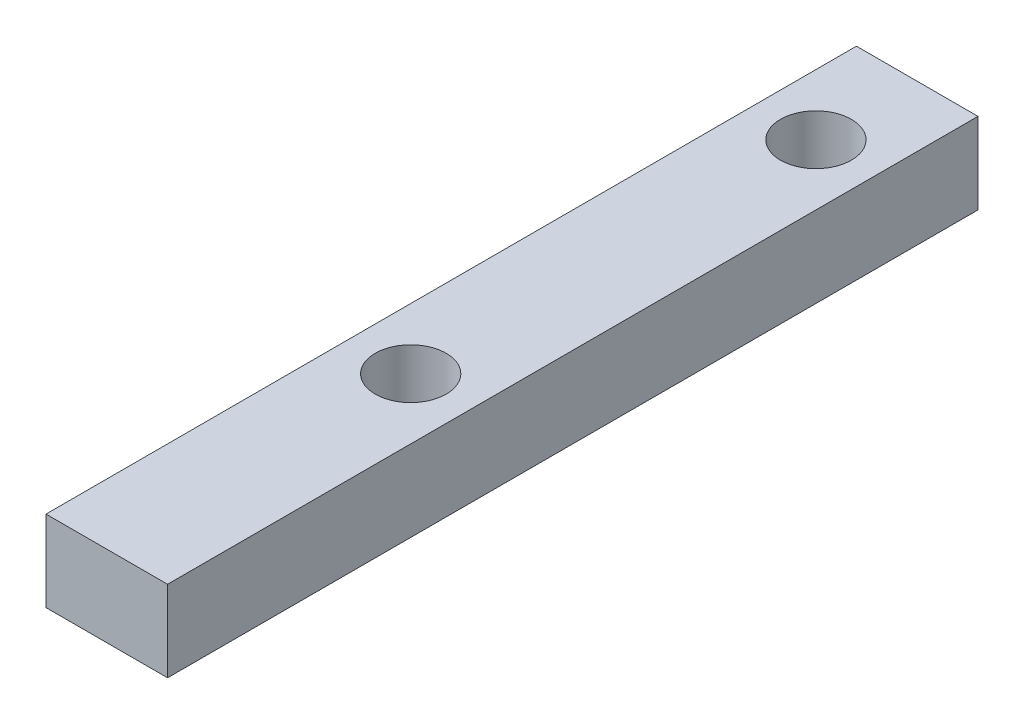
ISO-10303-21;
HEADER;
FILE_DESCRIPTION(('STEP AP214'),'2;1');
FILE_NAME('part.step','',(''),(''),'','','');
FILE_SCHEMA(('AUTOMOTIVE_DESIGN { 1 0 10303 214 1 1 1 1 }'));
ENDSEC;
DATA;
#1=APPLICATION_CONTEXT('core data for automotive mechanical design processes');
#2=APPLICATION_PROTOCOL_DEFINITION('international standard','automotive_design',2000,#1);
#3=PRODUCT_CONTEXT('',#1,'mechanical');
#4=PRODUCT('Part','Part','',(#3));
#5=PRODUCT_RELATED_PRODUCT_CATEGORY('part','',(#4));
#6=PRODUCT_DEFINITION_FORMATION('','',#4);
#7=PRODUCT_DEFINITION_CONTEXT('part definition',#1,'design');
#8=PRODUCT_DEFINITION('design','',#6,#7);
#9=PRODUCT_DEFINITION_SHAPE('','',#8);
#10=(LENGTH_UNIT() NAMED_UNIT(*) SI_UNIT(.MILLI.,.METRE.));
#11=(NAMED_UNIT(*) PLANE_ANGLE_UNIT() SI_UNIT($,.RADIAN.));
#12=(NAMED_UNIT(*) SI_UNIT($,.STERADIAN.) SOLID_ANGLE_UNIT());
#13=UNCERTAINTY_MEASURE_WITH_UNIT(LENGTH_MEASURE(1.E-05),#10,'distance_accuracy_value','');
#14=(GEOMETRIC_REPRESENTATION_CONTEXT(3) GLOBAL_UNCERTAINTY_ASSIGNED_CONTEXT((#13)) GLOBAL_UNIT_ASSIGNED_CONTEXT((#10,
#11,#12)) REPRESENTATION_CONTEXT('',''));
#15=CARTESIAN_POINT('',(0.,0.,0.));
#16=DIRECTION('',(0.,0.,1.));
#17=DIRECTION('',(1.,0.,0.));
#18=AXIS2_PLACEMENT_3D('',#15,#16,#17);
#19=CARTESIAN_POINT('',(0.,4.,0.));
#20=DIRECTION('',(0.,1.,0.));
#21=DIRECTION('',(0.,0.,1.));
#22=AXIS2_PLACEMENT_3D('',#19,#20,#21);
#23=PLANE('',#22);
#24=CARTESIAN_POINT('',(0.,4.,-15.));
#25=DIRECTION('',(0.,1.,0.));
#26=DIRECTION('',(0.,0.,1.));
#27=AXIS2_PLACEMENT_3D('',#24,#25,#26);
#28=CIRCLE('',#27,1.75);
#29=CARTESIAN_POINT('',(0.,4.,-13.25));
#30=VERTEX_POINT('',#29);
#31=EDGE_CURVE('E112',#30,#30,#28,.T.);
#32=ORIENTED_EDGE('',*,*,#31,.F.);
#33=EDGE_LOOP('',(#32));
#34=FACE_BOUND('',#33,.T.);
#35=DIRECTION('',(0.,0.,-1.));
#36=VECTOR('',#35,1.);
#37=CARTESIAN_POINT('',(3.,4.,-20.));
#38=LINE('',#37,#36);
#39=CARTESIAN_POINT('',(3.,4.,20.));
#40=VERTEX_POINT('',#39);
#41=CARTESIAN_POINT('',(3.,4.,-20.));
#42=VERTEX_POINT('',#41);
#43=EDGE_CURVE('E92',#40,#42,#38,.T.);
#44=ORIENTED_EDGE('',*,*,#43,.T.);
#45=DIRECTION('',(-1.,0.,0.));
#46=VECTOR('',#45,1.);
#47=CARTESIAN_POINT('',(-3.,4.,-20.));
#48=LINE('',#47,#46);
#49=CARTESIAN_POINT('',(-3.,4.,-20.));
#50=VERTEX_POINT('',#49);
#51=EDGE_CURVE('E87',#42,#50,#48,.T.);
#52=ORIENTED_EDGE('',*,*,#51,.T.);
#53=DIRECTION('',(0.,0.,1.));
#54=VECTOR('',#53,1.);
#55=CARTESIAN_POINT('',(-3.,4.,-20.));
#56=LINE('',#55,#54);
#57=CARTESIAN_POINT('',(-3.,4.,20.));
#58=VERTEX_POINT('',#57);
#59=EDGE_CURVE('E90',#50,#58,#56,.T.);
#60=ORIENTED_EDGE('',*,*,#59,.T.);
#61=DIRECTION('',(1.,0.,0.));
#62=VECTOR('',#61,1.);
#63=CARTESIAN_POINT('',(-3.,4.,20.));
#64=LINE('',#63,#62);
#65=EDGE_CURVE('E57',#58,#40,#64,.T.);
#66=ORIENTED_EDGE('',*,*,#65,.T.);
#67=EDGE_LOOP('',(#44,#52,#60,#66));
#68=FACE_BOUND('',#67,.T.);
#69=CARTESIAN_POINT('',(0.,4.,5.));
#70=DIRECTION('',(0.,1.,0.));
#71=DIRECTION('',(0.,0.,1.));
#72=AXIS2_PLACEMENT_3D('',#69,#70,#71);
#73=CIRCLE('',#72,1.75);
#74=CARTESIAN_POINT('',(0.,4.,6.75));
#75=VERTEX_POINT('',#74);
#76=EDGE_CURVE('E134',#75,#75,#73,.T.);
#77=ORIENTED_EDGE('',*,*,#76,.F.);
#78=EDGE_LOOP('',(#77));
#79=FACE_BOUND('',#78,.T.);
#80=ADVANCED_FACE('F39',(#34,#68,#79),#23,.T.);
#81=CARTESIAN_POINT('',(0.,0.,0.));
#82=DIRECTION('',(0.,1.,0.));
#83=DIRECTION('',(0.,0.,1.));
#84=AXIS2_PLACEMENT_3D('',#81,#82,#83);
#85=PLANE('',#84);
#86=DIRECTION('',(0.,0.,-1.));
#87=VECTOR('',#86,1.);
#88=CARTESIAN_POINT('',(3.,0.,-20.));
#89=LINE('',#88,#87);
#90=CARTESIAN_POINT('',(3.,0.,20.));
#91=VERTEX_POINT('',#90);
#92=CARTESIAN_POINT('',(3.,0.,-20.));
#93=VERTEX_POINT('',#92);
#94=EDGE_CURVE('E108',#91,#93,#89,.T.);
#95=ORIENTED_EDGE('',*,*,#94,.F.);
#96=DIRECTION('',(1.,0.,0.));
#97=VECTOR('',#96,1.);
#98=CARTESIAN_POINT('',(-3.,0.,20.));
#99=LINE('',#98,#97);
#100=CARTESIAN_POINT('',(-3.,0.,20.));
#101=VERTEX_POINT('',#100);
#102=EDGE_CURVE('E80',#101,#91,#99,.T.);
#103=ORIENTED_EDGE('',*,*,#102,.F.);
#104=DIRECTION('',(0.,0.,1.));
#105=VECTOR('',#104,1.);
#106=CARTESIAN_POINT('',(-3.,0.,-20.));
#107=LINE('',#106,#105);
#108=CARTESIAN_POINT('',(-3.,0.,-20.));
#109=VERTEX_POINT('',#108);
#110=EDGE_CURVE('E74',#109,#101,#107,.T.);
#111=ORIENTED_EDGE('',*,*,#110,.F.);
#112=DIRECTION('',(-1.,0.,0.));
#113=VECTOR('',#112,1.);
#114=CARTESIAN_POINT('',(-3.,0.,-20.));
#115=LINE('',#114,#113);
#116=EDGE_CURVE('E97',#93,#109,#115,.T.);
#117=ORIENTED_EDGE('',*,*,#116,.F.);
#118=EDGE_LOOP('',(#95,#103,#111,#117));
#119=FACE_BOUND('',#118,.T.);
#120=CARTESIAN_POINT('',(0.,0.,-15.));
#121=DIRECTION('',(0.,1.,0.));
#122=DIRECTION('',(0.,0.,1.));
#123=AXIS2_PLACEMENT_3D('',#120,#121,#122);
#124=CIRCLE('',#123,1.75);
#125=CARTESIAN_POINT('',(0.,0.,-13.25));
#126=VERTEX_POINT('',#125);
#127=EDGE_CURVE('E130',#126,#126,#124,.T.);
#128=ORIENTED_EDGE('',*,*,#127,.T.);
#129=EDGE_LOOP('',(#128));
#130=FACE_BOUND('',#129,.T.);
#131=CARTESIAN_POINT('',(0.,0.,5.));
#132=DIRECTION('',(0.,1.,0.));
#133=DIRECTION('',(0.,0.,1.));
#134=AXIS2_PLACEMENT_3D('',#131,#132,#133);
#135=CIRCLE('',#134,1.75);
#136=CARTESIAN_POINT('',(0.,0.,6.75));
#137=VERTEX_POINT('',#136);
#138=EDGE_CURVE('E138',#137,#137,#135,.T.);
#139=ORIENTED_EDGE('',*,*,#138,.T.);
#140=EDGE_LOOP('',(#139));
#141=FACE_BOUND('',#140,.T.);
#142=ADVANCED_FACE('F125',(#119,#130,#141),#85,.F.);
#143=CARTESIAN_POINT('',(3.,4.,-20.));
#144=DIRECTION('',(-1.,0.,0.));
#145=DIRECTION('',(0.,0.,1.));
#146=AXIS2_PLACEMENT_3D('',#143,#144,#145);
#147=PLANE('',#146);
#148=ORIENTED_EDGE('',*,*,#94,.T.);
#149=DIRECTION('',(0.,-1.,0.));
#150=VECTOR('',#149,1.);
#151=CARTESIAN_POINT('',(3.,4.,-20.));
#152=LINE('',#151,#150);
#153=EDGE_CURVE('E11',#42,#93,#152,.T.);
#154=ORIENTED_EDGE('',*,*,#153,.F.);
#155=ORIENTED_EDGE('',*,*,#43,.F.);
#156=DIRECTION('',(0.,-1.,0.));
#157=VECTOR('',#156,1.);
#158=CARTESIAN_POINT('',(3.,4.,20.));
#159=LINE('',#158,#157);
#160=EDGE_CURVE('E104',#40,#91,#159,.T.);
#161=ORIENTED_EDGE('',*,*,#160,.T.);
#162=EDGE_LOOP('',(#148,#154,#155,#161));
#163=FACE_BOUND('',#162,.T.);
#164=ADVANCED_FACE('F41',(#163),#147,.F.);
#165=CARTESIAN_POINT('',(-3.,4.,-20.));
#166=DIRECTION('',(0.,0.,1.));
#167=DIRECTION('',(1.,0.,0.));
#168=AXIS2_PLACEMENT_3D('',#165,#166,#167);
#169=PLANE('',#168);
#170=ORIENTED_EDGE('',*,*,#116,.T.);
#171=DIRECTION('',(0.,-1.,0.));
#172=VECTOR('',#171,1.);
#173=CARTESIAN_POINT('',(-3.,4.,-20.));
#174=LINE('',#173,#172);
#175=EDGE_CURVE('E49',#50,#109,#174,.T.);
#176=ORIENTED_EDGE('',*,*,#175,.F.);
#177=ORIENTED_EDGE('',*,*,#51,.F.);
#178=ORIENTED_EDGE('',*,*,#153,.T.);
#179=EDGE_LOOP('',(#170,#176,#177,#178));
#180=FACE_BOUND('',#179,.T.);
#181=ADVANCED_FACE('F96',(#180),#169,.F.);
#182=CARTESIAN_POINT('',(-3.,4.,-20.));
#183=DIRECTION('',(1.,0.,0.));
#184=DIRECTION('',(0.,0.,-1.));
#185=AXIS2_PLACEMENT_3D('',#182,#183,#184);
#186=PLANE('',#185);
#187=ORIENTED_EDGE('',*,*,#110,.T.);
#188=DIRECTION('',(0.,-1.,0.));
#189=VECTOR('',#188,1.);
#190=CARTESIAN_POINT('',(-3.,4.,20.));
#191=LINE('',#190,#189);
#192=EDGE_CURVE('E99',#58,#101,#191,.T.);
#193=ORIENTED_EDGE('',*,*,#192,.F.);
#194=ORIENTED_EDGE('',*,*,#59,.F.);
#195=ORIENTED_EDGE('',*,*,#175,.T.);
#196=EDGE_LOOP('',(#187,#193,#194,#195));
#197=FACE_BOUND('',#196,.T.);
#198=ADVANCED_FACE('F100',(#197),#186,.F.);
#199=CARTESIAN_POINT('',(-3.,4.,20.));
#200=DIRECTION('',(0.,0.,-1.));
#201=DIRECTION('',(-1.,0.,0.));
#202=AXIS2_PLACEMENT_3D('',#199,#200,#201);
#203=PLANE('',#202);
#204=ORIENTED_EDGE('',*,*,#102,.T.);
#205=ORIENTED_EDGE('',*,*,#160,.F.);
#206=ORIENTED_EDGE('',*,*,#65,.F.);
#207=ORIENTED_EDGE('',*,*,#192,.T.);
#208=EDGE_LOOP('',(#204,#205,#206,#207));
#209=FACE_BOUND('',#208,.T.);
#210=ADVANCED_FACE('F122',(#209),#203,.F.);
#211=CARTESIAN_POINT('',(0.,4.,-15.));
#212=DIRECTION('',(0.,-1.,0.));
#213=DIRECTION('',(0.,0.,-1.));
#214=AXIS2_PLACEMENT_3D('',#211,#212,#213);
#215=CYLINDRICAL_SURFACE('',#214,1.75);
#216=ORIENTED_EDGE('',*,*,#31,.T.);
#217=EDGE_LOOP('',(#216));
#218=FACE_BOUND('',#217,.T.);
#219=ORIENTED_EDGE('',*,*,#127,.F.);
#220=EDGE_LOOP('',(#219));
#221=FACE_BOUND('',#220,.T.);
#222=ADVANCED_FACE('F157',(#218,#221),#215,.F.);
#223=CARTESIAN_POINT('',(0.,4.,5.));
#224=DIRECTION('',(0.,-1.,0.));
#225=DIRECTION('',(0.,0.,-1.));
#226=AXIS2_PLACEMENT_3D('',#223,#224,#225);
#227=CYLINDRICAL_SURFACE('',#226,1.75);
#228=ORIENTED_EDGE('',*,*,#76,.T.);
#229=EDGE_LOOP('',(#228));
#230=FACE_BOUND('',#229,.T.);
#231=ORIENTED_EDGE('',*,*,#138,.F.);
#232=EDGE_LOOP('',(#231));
#233=FACE_BOUND('',#232,.T.);
#234=ADVANCED_FACE('F146',(#230,#233),#227,.F.);
#235=CLOSED_SHELL('',(#80,#142,#164,#181,#198,#210,#222,#234));
#236=MANIFOLD_SOLID_BREP('B2',#235);
#237=ADVANCED_BREP_SHAPE_REPRESENTATION('',(#18,#236),#14);
#238=SHAPE_DEFINITION_REPRESENTATION(#9,#237);
ENDSEC;
END-ISO-10303-21;
